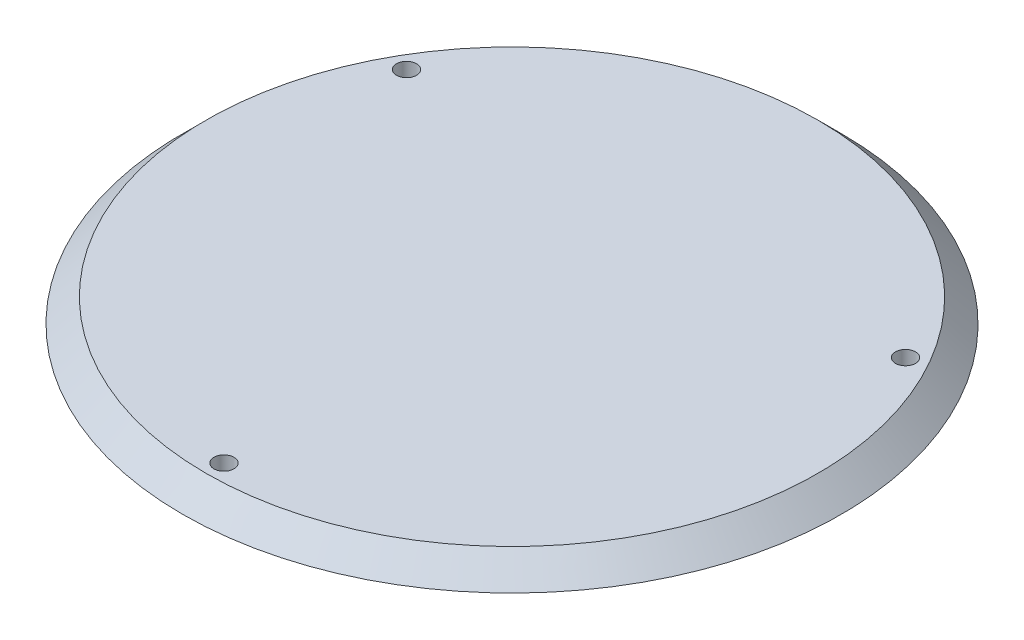
ISO-10303-21;
HEADER;
FILE_DESCRIPTION(('STEP AP214'),'2;1');
FILE_NAME('part.step','',(''),(''),'','','');
FILE_SCHEMA(('AUTOMOTIVE_DESIGN { 1 0 10303 214 1 1 1 1 }'));
ENDSEC;
DATA;
#1=APPLICATION_CONTEXT('core data for automotive mechanical design processes');
#2=APPLICATION_PROTOCOL_DEFINITION('international standard','automotive_design',2000,#1);
#3=PRODUCT_CONTEXT('',#1,'mechanical');
#4=PRODUCT('Part','Part','',(#3));
#5=PRODUCT_RELATED_PRODUCT_CATEGORY('part','',(#4));
#6=PRODUCT_DEFINITION_FORMATION('','',#4);
#7=PRODUCT_DEFINITION_CONTEXT('part definition',#1,'design');
#8=PRODUCT_DEFINITION('design','',#6,#7);
#9=PRODUCT_DEFINITION_SHAPE('','',#8);
#10=(LENGTH_UNIT() NAMED_UNIT(*) SI_UNIT(.MILLI.,.METRE.));
#11=(NAMED_UNIT(*) PLANE_ANGLE_UNIT() SI_UNIT($,.RADIAN.));
#12=(NAMED_UNIT(*) SI_UNIT($,.STERADIAN.) SOLID_ANGLE_UNIT());
#13=UNCERTAINTY_MEASURE_WITH_UNIT(LENGTH_MEASURE(1.E-05),#10,'distance_accuracy_value','');
#14=(GEOMETRIC_REPRESENTATION_CONTEXT(3) GLOBAL_UNCERTAINTY_ASSIGNED_CONTEXT((#13)) GLOBAL_UNIT_ASSIGNED_CONTEXT((#10,
#11,#12)) REPRESENTATION_CONTEXT('',''));
#15=CARTESIAN_POINT('',(0.,0.,0.));
#16=DIRECTION('',(0.,0.,1.));
#17=DIRECTION('',(1.,0.,0.));
#18=AXIS2_PLACEMENT_3D('',#15,#16,#17);
#19=CARTESIAN_POINT('',(0.,0.,0.));
#20=DIRECTION('',(0.,1.,0.));
#21=DIRECTION('',(0.,0.,1.));
#22=AXIS2_PLACEMENT_3D('',#19,#20,#21);
#23=PLANE('',#22);
#24=CARTESIAN_POINT('',(0.,0.,0.));
#25=DIRECTION('',(0.,1.,0.));
#26=DIRECTION('',(0.,0.,1.));
#27=AXIS2_PLACEMENT_3D('',#24,#25,#26);
#28=CIRCLE('',#27,32.2);
#29=CARTESIAN_POINT('',(-8.89347227809129,0.,-30.9474740623338));
#30=VERTEX_POINT('',#29);
#31=CARTESIAN_POINT('',(8.38733541641789,0.,-31.0884641726236));
#32=VERTEX_POINT('',#31);
#33=EDGE_CURVE('E146',#30,#32,#28,.T.);
#34=ORIENTED_EDGE('',*,*,#33,.F.);
#35=DIRECTION('',(0.390208164650931,0.,0.920726663152399));
#36=VECTOR('',#35,1.);
#37=CARTESIAN_POINT('',(-11.2221449119251,0.,-36.4421591508483));
#38=LINE('',#37,#36);
#39=CARTESIAN_POINT('',(-11.2221449119251,0.,-36.4421591508483));
#40=VERTEX_POINT('',#39);
#41=EDGE_CURVE('E93',#40,#30,#38,.T.);
#42=ORIENTED_EDGE('',*,*,#41,.F.);
#43=CARTESIAN_POINT('',(-8.73618292141357,0.,-37.4957211954058));
#44=DIRECTION('',(0.,1.,0.));
#45=DIRECTION('',(0.,0.,1.));
#46=AXIS2_PLACEMENT_3D('',#43,#44,#45);
#47=CIRCLE('',#46,2.70000000000001);
#48=CARTESIAN_POINT('',(-9.34885029512308,0.,-40.1252912532654));
#49=VERTEX_POINT('',#48);
#50=EDGE_CURVE('E155',#49,#40,#47,.T.);
#51=ORIENTED_EDGE('',*,*,#50,.F.);
#52=CARTESIAN_POINT('',(0.,0.,0.));
#53=DIRECTION('',(0.,1.,0.));
#54=DIRECTION('',(0.,0.,1.));
#55=AXIS2_PLACEMENT_3D('',#52,#53,#54);
#56=CIRCLE('',#55,41.2);
#57=CARTESIAN_POINT('',(8.69290340823466,0.,-40.2724897459184));
#58=VERTEX_POINT('',#57);
#59=EDGE_CURVE('E153',#58,#49,#56,.T.);
#60=ORIENTED_EDGE('',*,*,#59,.F.);
#61=CARTESIAN_POINT('',(8.12322284507366,0.,-37.6332731848995));
#62=DIRECTION('',(0.,1.,0.));
#63=DIRECTION('',(0.,0.,1.));
#64=AXIS2_PLACEMENT_3D('',#61,#62,#63);
#65=CIRCLE('',#64,2.70000000000001);
#66=CARTESIAN_POINT('',(10.6260442924437,0.,-36.6204134697442));
#67=VERTEX_POINT('',#66);
#68=EDGE_CURVE('E119',#67,#58,#65,.T.);
#69=ORIENTED_EDGE('',*,*,#68,.F.);
#70=DIRECTION('',(0.375133227835301,0.,-0.926970906433351));
#71=VECTOR('',#70,1.);
#72=CARTESIAN_POINT('',(8.38733541641789,0.,-31.0884641726236));
#73=LINE('',#72,#71);
#74=EDGE_CURVE('E149',#32,#67,#73,.T.);
#75=ORIENTED_EDGE('',*,*,#74,.F.);
#76=EDGE_LOOP('',(#34,#42,#51,#60,#69,#75));
#77=FACE_BOUND('',#76,.T.);
#78=CARTESIAN_POINT('',(0.,0.,0.));
#79=DIRECTION('',(0.,1.,0.));
#80=DIRECTION('',(0.,0.,1.));
#81=AXIS2_PLACEMENT_3D('',#78,#79,#80);
#82=CIRCLE('',#81,30.);
#83=CARTESIAN_POINT('',(-5.85778477725307,0.,-29.422548453582));
#84=VERTEX_POINT('',#83);
#85=CARTESIAN_POINT('',(5.37693340676365,0.,-29.5142099189395));
#86=VERTEX_POINT('',#85);
#87=EDGE_CURVE('E57',#84,#86,#82,.T.);
#88=ORIENTED_EDGE('',*,*,#87,.T.);
#89=DIRECTION('',(0.375133227835301,0.,-0.926970906433351));
#90=VECTOR('',#89,1.);
#91=CARTESIAN_POINT('',(5.37693340676365,0.,-29.5142099189395));
#92=LINE('',#91,#90);
#93=CARTESIAN_POINT('',(8.58670829829035,0.,-37.4457065709818));
#94=VERTEX_POINT('',#93);
#95=EDGE_CURVE('E277',#86,#94,#92,.T.);
#96=ORIENTED_EDGE('',*,*,#95,.T.);
#97=CARTESIAN_POINT('',(8.12322284507366,0.,-37.6332731848995));
#98=DIRECTION('',(0.,1.,0.));
#99=DIRECTION('',(0.,0.,1.));
#100=AXIS2_PLACEMENT_3D('',#97,#98,#99);
#101=CIRCLE('',#100,0.50000000000001);
#102=CARTESIAN_POINT('',(8.22871924565903,0.,-38.1220169924956));
#103=VERTEX_POINT('',#102);
#104=EDGE_CURVE('E280',#94,#103,#101,.T.);
#105=ORIENTED_EDGE('',*,*,#104,.T.);
#106=CARTESIAN_POINT('',(0.,0.,0.));
#107=DIRECTION('',(0.,1.,0.));
#108=DIRECTION('',(0.,0.,1.));
#109=AXIS2_PLACEMENT_3D('',#106,#107,#108);
#110=CIRCLE('',#109,39.);
#111=CARTESIAN_POINT('',(-8.84963984247088,0.,-37.9826786135279));
#112=VERTEX_POINT('',#111);
#113=EDGE_CURVE('E283',#103,#112,#110,.T.);
#114=ORIENTED_EDGE('',*,*,#113,.T.);
#115=CARTESIAN_POINT('',(-8.73618292141357,0.,-37.4957211954058));
#116=DIRECTION('',(0.,1.,0.));
#117=DIRECTION('',(0.,0.,1.));
#118=AXIS2_PLACEMENT_3D('',#115,#116,#117);
#119=CIRCLE('',#118,0.50000000000001);
#120=CARTESIAN_POINT('',(-9.19654625298978,0.,-37.3006171130803));
#121=VERTEX_POINT('',#120);
#122=EDGE_CURVE('E286',#112,#121,#119,.T.);
#123=ORIENTED_EDGE('',*,*,#122,.T.);
#124=DIRECTION('',(0.390208164650931,0.,0.9207266631524));
#125=VECTOR('',#124,1.);
#126=CARTESIAN_POINT('',(-9.19654625298978,0.,-37.3006171130803));
#127=LINE('',#126,#125);
#128=EDGE_CURVE('E260',#121,#84,#127,.T.);
#129=ORIENTED_EDGE('',*,*,#128,.T.);
#130=EDGE_LOOP('',(#88,#96,#105,#114,#123,#129));
#131=FACE_BOUND('',#130,.T.);
#132=ADVANCED_FACE('F41',(#77,#131),#23,.F.);
#133=CARTESIAN_POINT('',(0.,3.65,0.));
#134=DIRECTION('',(0.,-1.,0.));
#135=DIRECTION('',(0.,0.,-1.));
#136=AXIS2_PLACEMENT_3D('',#133,#134,#135);
#137=CYLINDRICAL_SURFACE('',#136,32.2);
#138=ORIENTED_EDGE('',*,*,#33,.T.);
#139=DIRECTION('',(0.,-1.,0.));
#140=VECTOR('',#139,1.);
#141=CARTESIAN_POINT('',(8.38733541641789,3.65,-31.0884641726236));
#142=LINE('',#141,#140);
#143=CARTESIAN_POINT('',(8.38733541641789,3.65,-31.0884641726236));
#144=VERTEX_POINT('',#143);
#145=EDGE_CURVE('E50',#144,#32,#142,.T.);
#146=ORIENTED_EDGE('',*,*,#145,.F.);
#147=CARTESIAN_POINT('',(0.,3.65,0.));
#148=DIRECTION('',(0.,1.,0.));
#149=DIRECTION('',(0.,0.,1.));
#150=AXIS2_PLACEMENT_3D('',#147,#148,#149);
#151=CIRCLE('',#150,32.2);
#152=CARTESIAN_POINT('',(-8.89347227809129,3.65,-30.9474740623338));
#153=VERTEX_POINT('',#152);
#154=EDGE_CURVE('E138',#153,#144,#151,.T.);
#155=ORIENTED_EDGE('',*,*,#154,.F.);
#156=DIRECTION('',(0.,-1.,0.));
#157=VECTOR('',#156,1.);
#158=CARTESIAN_POINT('',(-8.89347227809129,3.65,-30.9474740623338));
#159=LINE('',#158,#157);
#160=EDGE_CURVE('E145',#153,#30,#159,.T.);
#161=ORIENTED_EDGE('',*,*,#160,.T.);
#162=EDGE_LOOP('',(#138,#146,#155,#161));
#163=FACE_BOUND('',#162,.T.);
#164=ADVANCED_FACE('F165',(#163),#137,.T.);
#165=CARTESIAN_POINT('',(8.38733541641789,3.65,-31.0884641726236));
#166=DIRECTION('',(-0.926970906433351,0.,-0.375133227835301));
#167=DIRECTION('',(-0.375133227835301,0.,0.926970906433351));
#168=AXIS2_PLACEMENT_3D('',#165,#166,#167);
#169=PLANE('',#168);
#170=ORIENTED_EDGE('',*,*,#74,.T.);
#171=DIRECTION('',(0.,-1.,0.));
#172=VECTOR('',#171,1.);
#173=CARTESIAN_POINT('',(10.6260442924437,3.65,-36.6204134697442));
#174=LINE('',#173,#172);
#175=CARTESIAN_POINT('',(10.6260442924437,3.65,-36.6204134697442));
#176=VERTEX_POINT('',#175);
#177=EDGE_CURVE('E122',#176,#67,#174,.T.);
#178=ORIENTED_EDGE('',*,*,#177,.F.);
#179=DIRECTION('',(0.375133227835301,0.,-0.926970906433351));
#180=VECTOR('',#179,1.);
#181=CARTESIAN_POINT('',(8.38733541641789,3.65,-31.0884641726236));
#182=LINE('',#181,#180);
#183=EDGE_CURVE('E102',#144,#176,#182,.T.);
#184=ORIENTED_EDGE('',*,*,#183,.F.);
#185=ORIENTED_EDGE('',*,*,#145,.T.);
#186=EDGE_LOOP('',(#170,#178,#184,#185));
#187=FACE_BOUND('',#186,.T.);
#188=ADVANCED_FACE('F161',(#187),#169,.F.);
#189=CARTESIAN_POINT('',(8.12322284507366,3.65,-37.6332731848995));
#190=DIRECTION('',(0.,-1.,0.));
#191=DIRECTION('',(0.,0.,-1.));
#192=AXIS2_PLACEMENT_3D('',#189,#190,#191);
#193=CYLINDRICAL_SURFACE('',#192,2.70000000000001);
#194=ORIENTED_EDGE('',*,*,#68,.T.);
#195=DIRECTION('',(0.,-1.,0.));
#196=VECTOR('',#195,1.);
#197=CARTESIAN_POINT('',(8.69290340823466,3.65,-40.2724897459184));
#198=LINE('',#197,#196);
#199=CARTESIAN_POINT('',(8.69290340823466,3.65,-40.2724897459184));
#200=VERTEX_POINT('',#199);
#201=EDGE_CURVE('E112',#200,#58,#198,.T.);
#202=ORIENTED_EDGE('',*,*,#201,.F.);
#203=CARTESIAN_POINT('',(8.12322284507366,3.65,-37.6332731848995));
#204=DIRECTION('',(0.,1.,0.));
#205=DIRECTION('',(0.,0.,1.));
#206=AXIS2_PLACEMENT_3D('',#203,#204,#205);
#207=CIRCLE('',#206,2.70000000000001);
#208=EDGE_CURVE('E117',#176,#200,#207,.T.);
#209=ORIENTED_EDGE('',*,*,#208,.F.);
#210=ORIENTED_EDGE('',*,*,#177,.T.);
#211=EDGE_LOOP('',(#194,#202,#209,#210));
#212=FACE_BOUND('',#211,.T.);
#213=ADVANCED_FACE('F114',(#212),#193,.T.);
#214=CARTESIAN_POINT('',(0.,3.65,0.));
#215=DIRECTION('',(0.,-1.,0.));
#216=DIRECTION('',(0.,0.,-1.));
#217=AXIS2_PLACEMENT_3D('',#214,#215,#216);
#218=CYLINDRICAL_SURFACE('',#217,41.2);
#219=ORIENTED_EDGE('',*,*,#59,.T.);
#220=DIRECTION('',(0.,-1.,0.));
#221=VECTOR('',#220,1.);
#222=CARTESIAN_POINT('',(-9.34885029512308,3.65,-40.1252912532654));
#223=LINE('',#222,#221);
#224=CARTESIAN_POINT('',(-9.34885029512308,3.65,-40.1252912532654));
#225=VERTEX_POINT('',#224);
#226=EDGE_CURVE('E123',#225,#49,#223,.T.);
#227=ORIENTED_EDGE('',*,*,#226,.F.);
#228=CARTESIAN_POINT('',(0.,3.65,0.));
#229=DIRECTION('',(0.,1.,0.));
#230=DIRECTION('',(0.,0.,1.));
#231=AXIS2_PLACEMENT_3D('',#228,#229,#230);
#232=CIRCLE('',#231,41.2);
#233=EDGE_CURVE('E126',#200,#225,#232,.T.);
#234=ORIENTED_EDGE('',*,*,#233,.F.);
#235=ORIENTED_EDGE('',*,*,#201,.T.);
#236=EDGE_LOOP('',(#219,#227,#234,#235));
#237=FACE_BOUND('',#236,.T.);
#238=ADVANCED_FACE('F127',(#237),#218,.T.);
#239=CARTESIAN_POINT('',(-8.73618292141357,3.65,-37.4957211954058));
#240=DIRECTION('',(0.,-1.,0.));
#241=DIRECTION('',(0.,0.,-1.));
#242=AXIS2_PLACEMENT_3D('',#239,#240,#241);
#243=CYLINDRICAL_SURFACE('',#242,2.70000000000001);
#244=ORIENTED_EDGE('',*,*,#50,.T.);
#245=DIRECTION('',(0.,-1.,0.));
#246=VECTOR('',#245,1.);
#247=CARTESIAN_POINT('',(-11.2221449119251,3.65,-36.4421591508483));
#248=LINE('',#247,#246);
#249=CARTESIAN_POINT('',(-11.2221449119251,3.65,-36.4421591508483));
#250=VERTEX_POINT('',#249);
#251=EDGE_CURVE('E66',#250,#40,#248,.T.);
#252=ORIENTED_EDGE('',*,*,#251,.F.);
#253=CARTESIAN_POINT('',(-8.73618292141357,3.65,-37.4957211954058));
#254=DIRECTION('',(0.,1.,0.));
#255=DIRECTION('',(0.,0.,1.));
#256=AXIS2_PLACEMENT_3D('',#253,#254,#255);
#257=CIRCLE('',#256,2.70000000000001);
#258=EDGE_CURVE('E131',#225,#250,#257,.T.);
#259=ORIENTED_EDGE('',*,*,#258,.F.);
#260=ORIENTED_EDGE('',*,*,#226,.T.);
#261=EDGE_LOOP('',(#244,#252,#259,#260));
#262=FACE_BOUND('',#261,.T.);
#263=ADVANCED_FACE('F169',(#262),#243,.T.);
#264=CARTESIAN_POINT('',(-11.2221449119251,3.65,-36.4421591508483));
#265=DIRECTION('',(0.920726663152399,0.,-0.390208164650931));
#266=DIRECTION('',(-0.390208164650931,0.,-0.920726663152399));
#267=AXIS2_PLACEMENT_3D('',#264,#265,#266);
#268=PLANE('',#267);
#269=ORIENTED_EDGE('',*,*,#41,.T.);
#270=ORIENTED_EDGE('',*,*,#160,.F.);
#271=DIRECTION('',(0.390208164650931,0.,0.920726663152399));
#272=VECTOR('',#271,1.);
#273=CARTESIAN_POINT('',(-11.2221449119251,3.65,-36.4421591508483));
#274=LINE('',#273,#272);
#275=EDGE_CURVE('E143',#250,#153,#274,.T.);
#276=ORIENTED_EDGE('',*,*,#275,.F.);
#277=ORIENTED_EDGE('',*,*,#251,.T.);
#278=EDGE_LOOP('',(#269,#270,#276,#277));
#279=FACE_BOUND('',#278,.T.);
#280=ADVANCED_FACE('F174',(#279),#268,.F.);
#281=CARTESIAN_POINT('',(0.,3.65,0.));
#282=DIRECTION('',(0.,-1.,0.));
#283=DIRECTION('',(0.,0.,-1.));
#284=AXIS2_PLACEMENT_3D('',#281,#282,#283);
#285=CYLINDRICAL_SURFACE('',#284,30.);
#286=ORIENTED_EDGE('',*,*,#87,.F.);
#287=DIRECTION('',(0.,-1.,0.));
#288=VECTOR('',#287,1.);
#289=CARTESIAN_POINT('',(-5.85778477725307,3.65,-29.422548453582));
#290=LINE('',#289,#288);
#291=CARTESIAN_POINT('',(-5.85778477725307,3.65,-29.422548453582));
#292=VERTEX_POINT('',#291);
#293=EDGE_CURVE('E275',#292,#84,#290,.T.);
#294=ORIENTED_EDGE('',*,*,#293,.F.);
#295=CARTESIAN_POINT('',(0.,3.65,0.));
#296=DIRECTION('',(0.,1.,0.));
#297=DIRECTION('',(0.,0.,1.));
#298=AXIS2_PLACEMENT_3D('',#295,#296,#297);
#299=CIRCLE('',#298,30.);
#300=CARTESIAN_POINT('',(5.37693340676365,3.65,-29.5142099189395));
#301=VERTEX_POINT('',#300);
#302=EDGE_CURVE('E256',#292,#301,#299,.T.);
#303=ORIENTED_EDGE('',*,*,#302,.T.);
#304=DIRECTION('',(0.,-1.,0.));
#305=VECTOR('',#304,1.);
#306=CARTESIAN_POINT('',(5.37693340676365,3.65,-29.5142099189395));
#307=LINE('',#306,#305);
#308=EDGE_CURVE('E150',#301,#86,#307,.T.);
#309=ORIENTED_EDGE('',*,*,#308,.T.);
#310=EDGE_LOOP('',(#286,#294,#303,#309));
#311=FACE_BOUND('',#310,.T.);
#312=ADVANCED_FACE('F176',(#311),#285,.F.);
#313=CARTESIAN_POINT('',(5.37693340676365,3.65,-29.5142099189395));
#314=DIRECTION('',(-0.926970906433351,0.,-0.375133227835301));
#315=DIRECTION('',(-0.375133227835301,0.,0.926970906433351));
#316=AXIS2_PLACEMENT_3D('',#313,#314,#315);
#317=PLANE('',#316);
#318=ORIENTED_EDGE('',*,*,#95,.F.);
#319=ORIENTED_EDGE('',*,*,#308,.F.);
#320=DIRECTION('',(0.375133227835301,0.,-0.926970906433351));
#321=VECTOR('',#320,1.);
#322=CARTESIAN_POINT('',(5.37693340676365,3.65,-29.5142099189395));
#323=LINE('',#322,#321);
#324=CARTESIAN_POINT('',(8.58670829829035,3.65,-37.4457065709818));
#325=VERTEX_POINT('',#324);
#326=EDGE_CURVE('E259',#301,#325,#323,.T.);
#327=ORIENTED_EDGE('',*,*,#326,.T.);
#328=DIRECTION('',(0.,-1.,0.));
#329=VECTOR('',#328,1.);
#330=CARTESIAN_POINT('',(8.58670829829035,3.65,-37.4457065709818));
#331=LINE('',#330,#329);
#332=EDGE_CURVE('E301',#325,#94,#331,.T.);
#333=ORIENTED_EDGE('',*,*,#332,.T.);
#334=EDGE_LOOP('',(#318,#319,#327,#333));
#335=FACE_BOUND('',#334,.T.);
#336=ADVANCED_FACE('F182',(#335),#317,.T.);
#337=CARTESIAN_POINT('',(8.12322284507366,3.65,-37.6332731848995));
#338=DIRECTION('',(0.,-1.,0.));
#339=DIRECTION('',(0.,0.,-1.));
#340=AXIS2_PLACEMENT_3D('',#337,#338,#339);
#341=CYLINDRICAL_SURFACE('',#340,0.50000000000001);
#342=ORIENTED_EDGE('',*,*,#104,.F.);
#343=ORIENTED_EDGE('',*,*,#332,.F.);
#344=CARTESIAN_POINT('',(8.12322284507366,3.65,-37.6332731848995));
#345=DIRECTION('',(0.,1.,0.));
#346=DIRECTION('',(0.,0.,1.));
#347=AXIS2_PLACEMENT_3D('',#344,#345,#346);
#348=CIRCLE('',#347,0.50000000000001);
#349=CARTESIAN_POINT('',(8.22871924565903,3.65,-38.1220169924956));
#350=VERTEX_POINT('',#349);
#351=EDGE_CURVE('E263',#325,#350,#348,.T.);
#352=ORIENTED_EDGE('',*,*,#351,.T.);
#353=DIRECTION('',(0.,-1.,0.));
#354=VECTOR('',#353,1.);
#355=CARTESIAN_POINT('',(8.22871924565903,3.65,-38.1220169924956));
#356=LINE('',#355,#354);
#357=EDGE_CURVE('E298',#350,#103,#356,.T.);
#358=ORIENTED_EDGE('',*,*,#357,.T.);
#359=EDGE_LOOP('',(#342,#343,#352,#358));
#360=FACE_BOUND('',#359,.T.);
#361=ADVANCED_FACE('F193',(#360),#341,.F.);
#362=CARTESIAN_POINT('',(0.,3.65,0.));
#363=DIRECTION('',(0.,-1.,0.));
#364=DIRECTION('',(0.,0.,-1.));
#365=AXIS2_PLACEMENT_3D('',#362,#363,#364);
#366=CYLINDRICAL_SURFACE('',#365,39.);
#367=ORIENTED_EDGE('',*,*,#113,.F.);
#368=ORIENTED_EDGE('',*,*,#357,.F.);
#369=CARTESIAN_POINT('',(0.,3.65,0.));
#370=DIRECTION('',(0.,1.,0.));
#371=DIRECTION('',(0.,0.,1.));
#372=AXIS2_PLACEMENT_3D('',#369,#370,#371);
#373=CIRCLE('',#372,39.);
#374=CARTESIAN_POINT('',(-8.84963984247088,3.65,-37.9826786135279));
#375=VERTEX_POINT('',#374);
#376=EDGE_CURVE('E266',#350,#375,#373,.T.);
#377=ORIENTED_EDGE('',*,*,#376,.T.);
#378=DIRECTION('',(0.,-1.,0.));
#379=VECTOR('',#378,1.);
#380=CARTESIAN_POINT('',(-8.84963984247088,3.65,-37.9826786135279));
#381=LINE('',#380,#379);
#382=EDGE_CURVE('E295',#375,#112,#381,.T.);
#383=ORIENTED_EDGE('',*,*,#382,.T.);
#384=EDGE_LOOP('',(#367,#368,#377,#383));
#385=FACE_BOUND('',#384,.T.);
#386=ADVANCED_FACE('F197',(#385),#366,.F.);
#387=CARTESIAN_POINT('',(-8.73618292141357,3.65,-37.4957211954058));
#388=DIRECTION('',(0.,-1.,0.));
#389=DIRECTION('',(0.,0.,-1.));
#390=AXIS2_PLACEMENT_3D('',#387,#388,#389);
#391=CYLINDRICAL_SURFACE('',#390,0.50000000000001);
#392=ORIENTED_EDGE('',*,*,#122,.F.);
#393=ORIENTED_EDGE('',*,*,#382,.F.);
#394=CARTESIAN_POINT('',(-8.73618292141357,3.65,-37.4957211954058));
#395=DIRECTION('',(0.,1.,0.));
#396=DIRECTION('',(0.,0.,1.));
#397=AXIS2_PLACEMENT_3D('',#394,#395,#396);
#398=CIRCLE('',#397,0.50000000000001);
#399=CARTESIAN_POINT('',(-9.19654625298978,3.65,-37.3006171130803));
#400=VERTEX_POINT('',#399);
#401=EDGE_CURVE('E269',#375,#400,#398,.T.);
#402=ORIENTED_EDGE('',*,*,#401,.T.);
#403=DIRECTION('',(0.,-1.,0.));
#404=VECTOR('',#403,1.);
#405=CARTESIAN_POINT('',(-9.19654625298978,3.65,-37.3006171130803));
#406=LINE('',#405,#404);
#407=EDGE_CURVE('E292',#400,#121,#406,.T.);
#408=ORIENTED_EDGE('',*,*,#407,.T.);
#409=EDGE_LOOP('',(#392,#393,#402,#408));
#410=FACE_BOUND('',#409,.T.);
#411=ADVANCED_FACE('F201',(#410),#391,.F.);
#412=CARTESIAN_POINT('',(-9.19654625298978,3.65,-37.3006171130803));
#413=DIRECTION('',(0.920726663152399,0.,-0.390208164650931));
#414=DIRECTION('',(-0.390208164650931,0.,-0.920726663152399));
#415=AXIS2_PLACEMENT_3D('',#412,#413,#414);
#416=PLANE('',#415);
#417=ORIENTED_EDGE('',*,*,#128,.F.);
#418=ORIENTED_EDGE('',*,*,#407,.F.);
#419=DIRECTION('',(0.390208164650931,0.,0.9207266631524));
#420=VECTOR('',#419,1.);
#421=CARTESIAN_POINT('',(-9.19654625298978,3.65,-37.3006171130803));
#422=LINE('',#421,#420);
#423=EDGE_CURVE('E272',#400,#292,#422,.T.);
#424=ORIENTED_EDGE('',*,*,#423,.T.);
#425=ORIENTED_EDGE('',*,*,#293,.T.);
#426=EDGE_LOOP('',(#417,#418,#424,#425));
#427=FACE_BOUND('',#426,.T.);
#428=ADVANCED_FACE('F205',(#427),#416,.T.);
#429=CARTESIAN_POINT('',(0.,3.65,0.));
#430=DIRECTION('',(0.,1.,0.));
#431=DIRECTION('',(0.,0.,1.));
#432=AXIS2_PLACEMENT_3D('',#429,#430,#431);
#433=PLANE('',#432);
#434=ORIENTED_EDGE('',*,*,#326,.F.);
#435=ORIENTED_EDGE('',*,*,#302,.F.);
#436=ORIENTED_EDGE('',*,*,#423,.F.);
#437=ORIENTED_EDGE('',*,*,#401,.F.);
#438=ORIENTED_EDGE('',*,*,#376,.F.);
#439=ORIENTED_EDGE('',*,*,#351,.F.);
#440=EDGE_LOOP('',(#434,#435,#436,#437,#438,#439));
#441=FACE_BOUND('',#440,.T.);
#442=ADVANCED_FACE('F209',(#441),#433,.F.);
#443=CARTESIAN_POINT('',(0.,6.825,0.));
#444=DIRECTION('',(0.,1.,0.));
#445=DIRECTION('',(0.,0.,1.));
#446=AXIS2_PLACEMENT_3D('',#443,#444,#445);
#447=PLANE('',#446);
#448=CARTESIAN_POINT('',(-33.5584843966469,6.825,-19.3750000000002));
#449=DIRECTION('',(0.,1.,0.));
#450=DIRECTION('',(0.,0.,1.));
#451=AXIS2_PLACEMENT_3D('',#448,#449,#450);
#452=CIRCLE('',#451,1.35);
#453=CARTESIAN_POINT('',(-33.5584843966469,6.825,-18.0250000000002));
#454=VERTEX_POINT('',#453);
#455=EDGE_CURVE('E237',#454,#454,#452,.T.);
#456=ORIENTED_EDGE('',*,*,#455,.F.);
#457=EDGE_LOOP('',(#456));
#458=FACE_BOUND('',#457,.T.);
#459=CARTESIAN_POINT('',(33.5584843966472,6.825,-19.3749999999997));
#460=DIRECTION('',(0.,1.,0.));
#461=DIRECTION('',(0.,0.,1.));
#462=AXIS2_PLACEMENT_3D('',#459,#460,#461);
#463=CIRCLE('',#462,1.35);
#464=CARTESIAN_POINT('',(33.5584843966472,6.825,-18.0249999999997));
#465=VERTEX_POINT('',#464);
#466=EDGE_CURVE('E243',#465,#465,#463,.T.);
#467=ORIENTED_EDGE('',*,*,#466,.F.);
#468=EDGE_LOOP('',(#467));
#469=FACE_BOUND('',#468,.T.);
#470=CARTESIAN_POINT('',(0.,6.825,38.75));
#471=DIRECTION('',(0.,1.,0.));
#472=DIRECTION('',(0.,0.,1.));
#473=AXIS2_PLACEMENT_3D('',#470,#471,#472);
#474=CIRCLE('',#473,1.35);
#475=CARTESIAN_POINT('',(0.,6.825,40.1));
#476=VERTEX_POINT('',#475);
#477=EDGE_CURVE('E251',#476,#476,#474,.T.);
#478=ORIENTED_EDGE('',*,*,#477,.F.);
#479=EDGE_LOOP('',(#478));
#480=FACE_BOUND('',#479,.T.);
#481=CARTESIAN_POINT('',(0.,6.825,0.));
#482=DIRECTION('',(0.,1.,0.));
#483=DIRECTION('',(0.,0.,1.));
#484=AXIS2_PLACEMENT_3D('',#481,#482,#483);
#485=CIRCLE('',#484,41.155);
#486=CARTESIAN_POINT('',(0.,6.825,41.155));
#487=VERTEX_POINT('',#486);
#488=EDGE_CURVE('E11',#487,#487,#485,.T.);
#489=ORIENTED_EDGE('',*,*,#488,.T.);
#490=EDGE_LOOP('',(#489));
#491=FACE_BOUND('',#490,.T.);
#492=ADVANCED_FACE('F213',(#458,#469,#480,#491),#447,.T.);
#493=CARTESIAN_POINT('',(-33.5584843966469,3.65,-19.3750000000002));
#494=DIRECTION('',(0.,1.,0.));
#495=DIRECTION('',(0.,0.,1.));
#496=AXIS2_PLACEMENT_3D('',#493,#494,#495);
#497=CIRCLE('',#496,1.35);
#498=CARTESIAN_POINT('',(-33.5584843966469,3.65,-18.0250000000002));
#499=VERTEX_POINT('',#498);
#500=EDGE_CURVE('E234',#499,#499,#497,.T.);
#501=ORIENTED_EDGE('',*,*,#500,.T.);
#502=EDGE_LOOP('',(#501));
#503=FACE_BOUND('',#502,.T.);
#504=CARTESIAN_POINT('',(33.5584843966472,3.65,-19.3749999999997));
#505=DIRECTION('',(0.,1.,0.));
#506=DIRECTION('',(0.,0.,1.));
#507=AXIS2_PLACEMENT_3D('',#504,#505,#506);
#508=CIRCLE('',#507,1.35);
#509=CARTESIAN_POINT('',(33.5584843966472,3.65,-18.0249999999997));
#510=VERTEX_POINT('',#509);
#511=EDGE_CURVE('E238',#510,#510,#508,.T.);
#512=ORIENTED_EDGE('',*,*,#511,.T.);
#513=EDGE_LOOP('',(#512));
#514=FACE_BOUND('',#513,.T.);
#515=CARTESIAN_POINT('',(0.,3.65,38.75));
#516=DIRECTION('',(0.,1.,0.));
#517=DIRECTION('',(0.,0.,1.));
#518=AXIS2_PLACEMENT_3D('',#515,#516,#517);
#519=CIRCLE('',#518,1.35);
#520=CARTESIAN_POINT('',(0.,3.65,40.1));
#521=VERTEX_POINT('',#520);
#522=EDGE_CURVE('E248',#521,#521,#519,.T.);
#523=ORIENTED_EDGE('',*,*,#522,.T.);
#524=EDGE_LOOP('',(#523));
#525=FACE_BOUND('',#524,.T.);
#526=ORIENTED_EDGE('',*,*,#275,.T.);
#527=ORIENTED_EDGE('',*,*,#154,.T.);
#528=ORIENTED_EDGE('',*,*,#183,.T.);
#529=ORIENTED_EDGE('',*,*,#208,.T.);
#530=ORIENTED_EDGE('',*,*,#233,.T.);
#531=ORIENTED_EDGE('',*,*,#258,.T.);
#532=EDGE_LOOP('',(#526,#527,#528,#529,#530,#531));
#533=FACE_BOUND('',#532,.T.);
#534=CARTESIAN_POINT('',(0.,3.65,0.));
#535=DIRECTION('',(0.,1.,0.));
#536=DIRECTION('',(0.,0.,1.));
#537=AXIS2_PLACEMENT_3D('',#534,#535,#536);
#538=CIRCLE('',#537,44.33);
#539=CARTESIAN_POINT('',(0.,3.65,44.33));
#540=VERTEX_POINT('',#539);
#541=EDGE_CURVE('E240',#540,#540,#538,.T.);
#542=ORIENTED_EDGE('',*,*,#541,.F.);
#543=EDGE_LOOP('',(#542));
#544=FACE_BOUND('',#543,.T.);
#545=ADVANCED_FACE('F134',(#503,#514,#525,#533,#544),#433,.F.);
#546=CARTESIAN_POINT('',(0.,6.825,0.));
#547=DIRECTION('',(0.,-1.,0.));
#548=DIRECTION('',(0.,0.,-1.));
#549=AXIS2_PLACEMENT_3D('',#546,#547,#548);
#550=CONICAL_SURFACE('',#549,41.155,0.785398163397446);
#551=ORIENTED_EDGE('',*,*,#541,.T.);
#552=EDGE_LOOP('',(#551));
#553=FACE_BOUND('',#552,.T.);
#554=ORIENTED_EDGE('',*,*,#488,.F.);
#555=EDGE_LOOP('',(#554));
#556=FACE_BOUND('',#555,.T.);
#557=ADVANCED_FACE('F44',(#553,#556),#550,.T.);
#558=CARTESIAN_POINT('',(0.,3.65,38.75));
#559=DIRECTION('',(0.,1.,0.));
#560=DIRECTION('',(0.,0.,1.));
#561=AXIS2_PLACEMENT_3D('',#558,#559,#560);
#562=CYLINDRICAL_SURFACE('',#561,1.35);
#563=ORIENTED_EDGE('',*,*,#522,.F.);
#564=EDGE_LOOP('',(#563));
#565=FACE_BOUND('',#564,.T.);
#566=ORIENTED_EDGE('',*,*,#477,.T.);
#567=EDGE_LOOP('',(#566));
#568=FACE_BOUND('',#567,.T.);
#569=ADVANCED_FACE('F218',(#565,#568),#562,.F.);
#570=CARTESIAN_POINT('',(33.5584843966472,3.65,-19.3749999999997));
#571=DIRECTION('',(0.,1.,0.));
#572=DIRECTION('',(0.,0.,1.));
#573=AXIS2_PLACEMENT_3D('',#570,#571,#572);
#574=CYLINDRICAL_SURFACE('',#573,1.35);
#575=ORIENTED_EDGE('',*,*,#511,.F.);
#576=EDGE_LOOP('',(#575));
#577=FACE_BOUND('',#576,.T.);
#578=ORIENTED_EDGE('',*,*,#466,.T.);
#579=EDGE_LOOP('',(#578));
#580=FACE_BOUND('',#579,.T.);
#581=ADVANCED_FACE('F221',(#577,#580),#574,.F.);
#582=CARTESIAN_POINT('',(-33.5584843966469,3.65,-19.3750000000002));
#583=DIRECTION('',(0.,1.,0.));
#584=DIRECTION('',(0.,0.,1.));
#585=AXIS2_PLACEMENT_3D('',#582,#583,#584);
#586=CYLINDRICAL_SURFACE('',#585,1.35);
#587=ORIENTED_EDGE('',*,*,#500,.F.);
#588=EDGE_LOOP('',(#587));
#589=FACE_BOUND('',#588,.T.);
#590=ORIENTED_EDGE('',*,*,#455,.T.);
#591=EDGE_LOOP('',(#590));
#592=FACE_BOUND('',#591,.T.);
#593=ADVANCED_FACE('F225',(#589,#592),#586,.F.);
#594=CLOSED_SHELL('',(#132,#164,#188,#213,#238,#263,#280,#312,#336,#361,#386,#411,#428,#442,
#492,#545,#557,#569,#581,#593));
#595=MANIFOLD_SOLID_BREP('B2',#594);
#596=ADVANCED_BREP_SHAPE_REPRESENTATION('',(#18,#595),#14);
#597=SHAPE_DEFINITION_REPRESENTATION(#9,#596);
ENDSEC;
END-ISO-10303-21;
